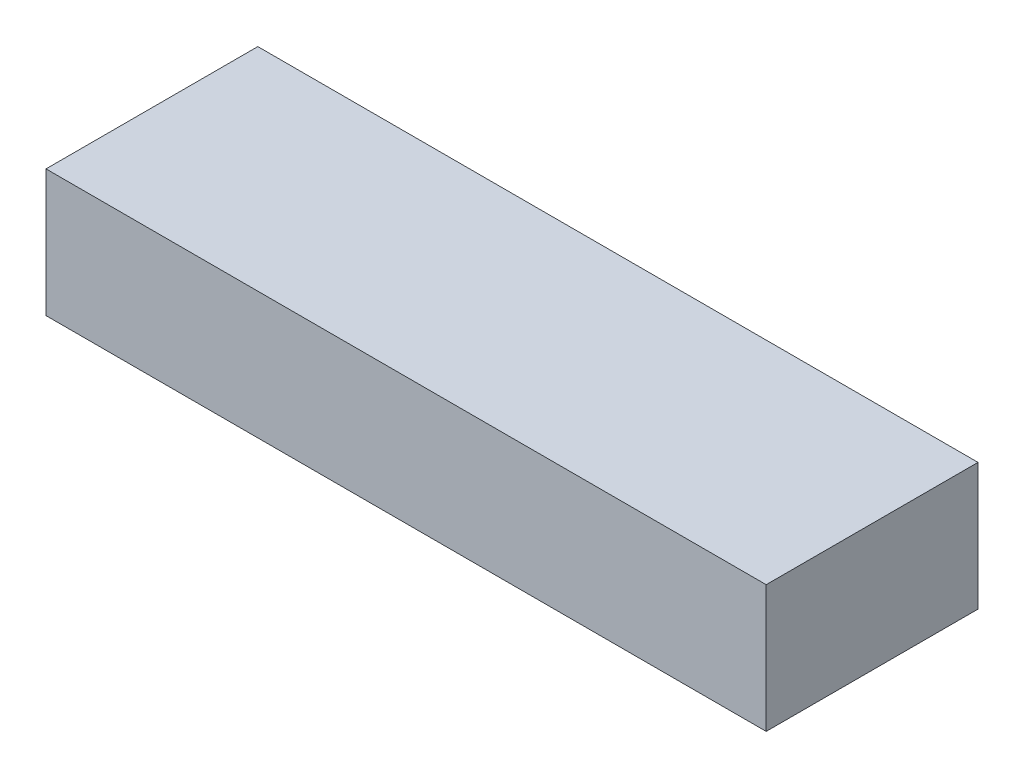
ISO-10303-21;
HEADER;
FILE_DESCRIPTION(('STEP AP214'),'2;1');
FILE_NAME('part.step','',(''),(''),'','','');
FILE_SCHEMA(('AUTOMOTIVE_DESIGN { 1 0 10303 214 1 1 1 1 }'));
ENDSEC;
DATA;
#1=APPLICATION_CONTEXT('core data for automotive mechanical design processes');
#2=APPLICATION_PROTOCOL_DEFINITION('international standard','automotive_design',2000,#1);
#3=PRODUCT_CONTEXT('',#1,'mechanical');
#4=PRODUCT('Part','Part','',(#3));
#5=PRODUCT_RELATED_PRODUCT_CATEGORY('part','',(#4));
#6=PRODUCT_DEFINITION_FORMATION('','',#4);
#7=PRODUCT_DEFINITION_CONTEXT('part definition',#1,'design');
#8=PRODUCT_DEFINITION('design','',#6,#7);
#9=PRODUCT_DEFINITION_SHAPE('','',#8);
#10=(LENGTH_UNIT() NAMED_UNIT(*) SI_UNIT(.MILLI.,.METRE.));
#11=(NAMED_UNIT(*) PLANE_ANGLE_UNIT() SI_UNIT($,.RADIAN.));
#12=(NAMED_UNIT(*) SI_UNIT($,.STERADIAN.) SOLID_ANGLE_UNIT());
#13=UNCERTAINTY_MEASURE_WITH_UNIT(LENGTH_MEASURE(1.E-05),#10,'distance_accuracy_value','');
#14=(GEOMETRIC_REPRESENTATION_CONTEXT(3) GLOBAL_UNCERTAINTY_ASSIGNED_CONTEXT((#13)) GLOBAL_UNIT_ASSIGNED_CONTEXT((#10,
#11,#12)) REPRESENTATION_CONTEXT('',''));
#15=CARTESIAN_POINT('',(0.,0.,0.));
#16=DIRECTION('',(0.,0.,1.));
#17=DIRECTION('',(1.,0.,0.));
#18=AXIS2_PLACEMENT_3D('',#15,#16,#17);
#19=CARTESIAN_POINT('',(34.,6.,-10.));
#20=DIRECTION('',(-1.,0.,0.));
#21=DIRECTION('',(0.,0.,1.));
#22=AXIS2_PLACEMENT_3D('',#19,#20,#21);
#23=PLANE('',#22);
#24=DIRECTION('',(0.,0.,-1.));
#25=VECTOR('',#24,1.);
#26=CARTESIAN_POINT('',(34.,-6.,-10.));
#27=LINE('',#26,#25);
#28=CARTESIAN_POINT('',(34.,-6.,10.));
#29=VERTEX_POINT('',#28);
#30=CARTESIAN_POINT('',(34.,-6.,-10.));
#31=VERTEX_POINT('',#30);
#32=EDGE_CURVE('E115',#29,#31,#27,.T.);
#33=ORIENTED_EDGE('',*,*,#32,.T.);
#34=DIRECTION('',(0.,-1.,0.));
#35=VECTOR('',#34,1.);
#36=CARTESIAN_POINT('',(34.,6.,-10.));
#37=LINE('',#36,#35);
#38=CARTESIAN_POINT('',(34.,6.,-10.));
#39=VERTEX_POINT('',#38);
#40=EDGE_CURVE('E11',#39,#31,#37,.T.);
#41=ORIENTED_EDGE('',*,*,#40,.F.);
#42=DIRECTION('',(0.,0.,-1.));
#43=VECTOR('',#42,1.);
#44=CARTESIAN_POINT('',(34.,6.,-10.));
#45=LINE('',#44,#43);
#46=CARTESIAN_POINT('',(34.,6.,10.));
#47=VERTEX_POINT('',#46);
#48=EDGE_CURVE('E99',#47,#39,#45,.T.);
#49=ORIENTED_EDGE('',*,*,#48,.F.);
#50=DIRECTION('',(0.,-1.,0.));
#51=VECTOR('',#50,1.);
#52=CARTESIAN_POINT('',(34.,6.,10.));
#53=LINE('',#52,#51);
#54=EDGE_CURVE('E111',#47,#29,#53,.T.);
#55=ORIENTED_EDGE('',*,*,#54,.T.);
#56=EDGE_LOOP('',(#33,#41,#49,#55));
#57=FACE_BOUND('',#56,.T.);
#58=ADVANCED_FACE('F47',(#57),#23,.F.);
#59=CARTESIAN_POINT('',(-34.,6.,-10.));
#60=DIRECTION('',(0.,0.,1.));
#61=DIRECTION('',(1.,0.,0.));
#62=AXIS2_PLACEMENT_3D('',#59,#60,#61);
#63=PLANE('',#62);
#64=DIRECTION('',(-1.,0.,0.));
#65=VECTOR('',#64,1.);
#66=CARTESIAN_POINT('',(-34.,-6.,-10.));
#67=LINE('',#66,#65);
#68=CARTESIAN_POINT('',(-34.,-6.,-10.));
#69=VERTEX_POINT('',#68);
#70=EDGE_CURVE('E104',#31,#69,#67,.T.);
#71=ORIENTED_EDGE('',*,*,#70,.T.);
#72=DIRECTION('',(0.,-1.,0.));
#73=VECTOR('',#72,1.);
#74=CARTESIAN_POINT('',(-34.,6.,-10.));
#75=LINE('',#74,#73);
#76=CARTESIAN_POINT('',(-34.,6.,-10.));
#77=VERTEX_POINT('',#76);
#78=EDGE_CURVE('E56',#77,#69,#75,.T.);
#79=ORIENTED_EDGE('',*,*,#78,.F.);
#80=DIRECTION('',(-1.,0.,0.));
#81=VECTOR('',#80,1.);
#82=CARTESIAN_POINT('',(-34.,6.,-10.));
#83=LINE('',#82,#81);
#84=EDGE_CURVE('E94',#39,#77,#83,.T.);
#85=ORIENTED_EDGE('',*,*,#84,.F.);
#86=ORIENTED_EDGE('',*,*,#40,.T.);
#87=EDGE_LOOP('',(#71,#79,#85,#86));
#88=FACE_BOUND('',#87,.T.);
#89=ADVANCED_FACE('F103',(#88),#63,.F.);
#90=CARTESIAN_POINT('',(-34.,6.,-10.));
#91=DIRECTION('',(1.,0.,0.));
#92=DIRECTION('',(0.,0.,-1.));
#93=AXIS2_PLACEMENT_3D('',#90,#91,#92);
#94=PLANE('',#93);
#95=DIRECTION('',(0.,0.,1.));
#96=VECTOR('',#95,1.);
#97=CARTESIAN_POINT('',(-34.,-6.,-10.));
#98=LINE('',#97,#96);
#99=CARTESIAN_POINT('',(-34.,-6.,10.));
#100=VERTEX_POINT('',#99);
#101=EDGE_CURVE('E81',#69,#100,#98,.T.);
#102=ORIENTED_EDGE('',*,*,#101,.T.);
#103=DIRECTION('',(0.,-1.,0.));
#104=VECTOR('',#103,1.);
#105=CARTESIAN_POINT('',(-34.,6.,10.));
#106=LINE('',#105,#104);
#107=CARTESIAN_POINT('',(-34.,6.,10.));
#108=VERTEX_POINT('',#107);
#109=EDGE_CURVE('E106',#108,#100,#106,.T.);
#110=ORIENTED_EDGE('',*,*,#109,.F.);
#111=DIRECTION('',(0.,0.,1.));
#112=VECTOR('',#111,1.);
#113=CARTESIAN_POINT('',(-34.,6.,-10.));
#114=LINE('',#113,#112);
#115=EDGE_CURVE('E97',#77,#108,#114,.T.);
#116=ORIENTED_EDGE('',*,*,#115,.F.);
#117=ORIENTED_EDGE('',*,*,#78,.T.);
#118=EDGE_LOOP('',(#102,#110,#116,#117));
#119=FACE_BOUND('',#118,.T.);
#120=ADVANCED_FACE('F107',(#119),#94,.F.);
#121=CARTESIAN_POINT('',(-34.,6.,10.));
#122=DIRECTION('',(0.,0.,-1.));
#123=DIRECTION('',(-1.,0.,0.));
#124=AXIS2_PLACEMENT_3D('',#121,#122,#123);
#125=PLANE('',#124);
#126=DIRECTION('',(1.,0.,0.));
#127=VECTOR('',#126,1.);
#128=CARTESIAN_POINT('',(-34.,-6.,10.));
#129=LINE('',#128,#127);
#130=EDGE_CURVE('E87',#100,#29,#129,.T.);
#131=ORIENTED_EDGE('',*,*,#130,.T.);
#132=ORIENTED_EDGE('',*,*,#54,.F.);
#133=DIRECTION('',(1.,0.,0.));
#134=VECTOR('',#133,1.);
#135=CARTESIAN_POINT('',(-34.,6.,10.));
#136=LINE('',#135,#134);
#137=EDGE_CURVE('E64',#108,#47,#136,.T.);
#138=ORIENTED_EDGE('',*,*,#137,.F.);
#139=ORIENTED_EDGE('',*,*,#109,.T.);
#140=EDGE_LOOP('',(#131,#132,#138,#139));
#141=FACE_BOUND('',#140,.T.);
#142=ADVANCED_FACE('F128',(#141),#125,.F.);
#143=CARTESIAN_POINT('',(0.,6.,0.));
#144=DIRECTION('',(0.,1.,0.));
#145=DIRECTION('',(0.,0.,1.));
#146=AXIS2_PLACEMENT_3D('',#143,#144,#145);
#147=PLANE('',#146);
#148=ORIENTED_EDGE('',*,*,#48,.T.);
#149=ORIENTED_EDGE('',*,*,#84,.T.);
#150=ORIENTED_EDGE('',*,*,#115,.T.);
#151=ORIENTED_EDGE('',*,*,#137,.T.);
#152=EDGE_LOOP('',(#148,#149,#150,#151));
#153=FACE_BOUND('',#152,.T.);
#154=ADVANCED_FACE('F95',(#153),#147,.T.);
#155=CARTESIAN_POINT('',(0.,-6.,0.));
#156=DIRECTION('',(0.,1.,0.));
#157=DIRECTION('',(0.,0.,1.));
#158=AXIS2_PLACEMENT_3D('',#155,#156,#157);
#159=PLANE('',#158);
#160=ORIENTED_EDGE('',*,*,#32,.F.);
#161=ORIENTED_EDGE('',*,*,#130,.F.);
#162=ORIENTED_EDGE('',*,*,#101,.F.);
#163=ORIENTED_EDGE('',*,*,#70,.F.);
#164=EDGE_LOOP('',(#160,#161,#162,#163));
#165=FACE_BOUND('',#164,.T.);
#166=ADVANCED_FACE('F131',(#165),#159,.F.);
#167=CLOSED_SHELL('',(#58,#89,#120,#142,#154,#166));
#168=MANIFOLD_SOLID_BREP('B2',#167);
#169=ADVANCED_BREP_SHAPE_REPRESENTATION('',(#18,#168),#14);
#170=SHAPE_DEFINITION_REPRESENTATION(#9,#169);
ENDSEC;
END-ISO-10303-21;
